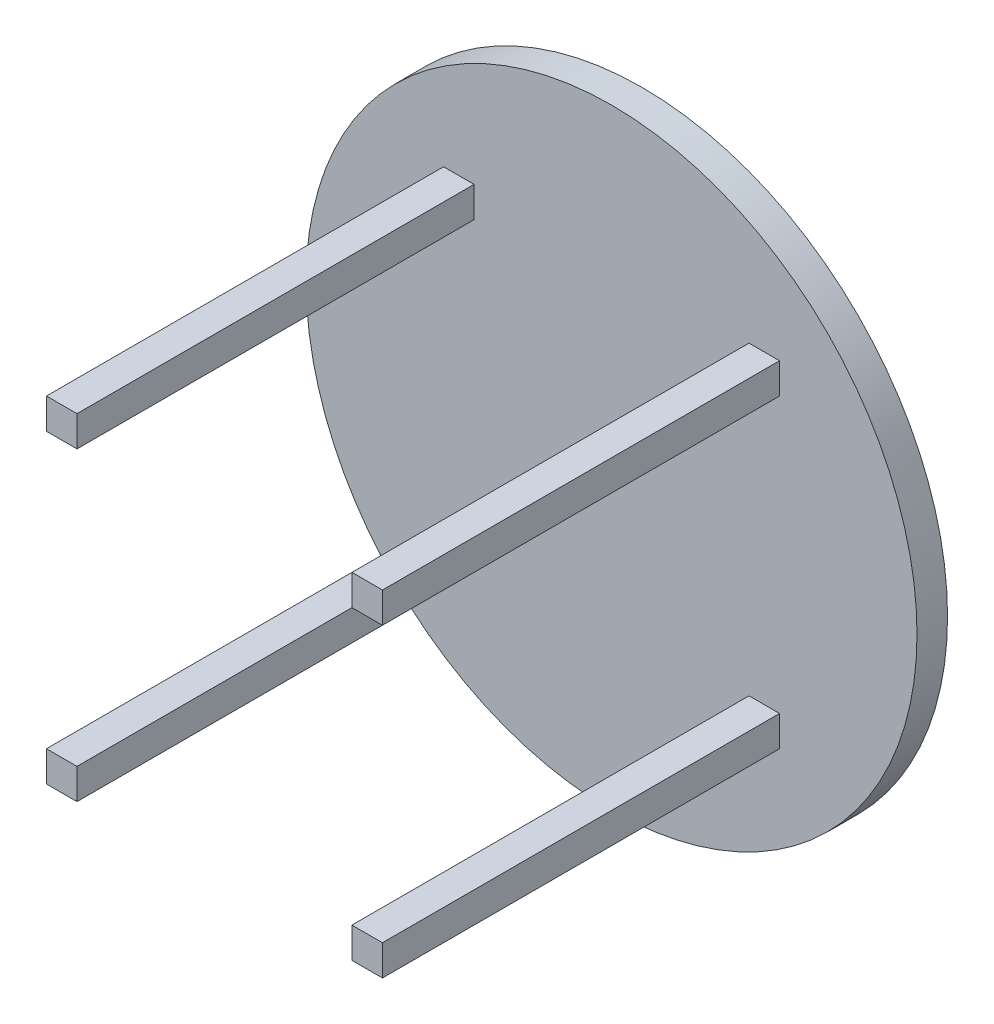
ISO-10303-21;
HEADER;
FILE_DESCRIPTION(('STEP AP214'),'2;1');
FILE_NAME('part.step','',(''),(''),'','','');
FILE_SCHEMA(('AUTOMOTIVE_DESIGN { 1 0 10303 214 1 1 1 1 }'));
ENDSEC;
DATA;
#1=APPLICATION_CONTEXT('core data for automotive mechanical design processes');
#2=APPLICATION_PROTOCOL_DEFINITION('international standard','automotive_design',2000,#1);
#3=PRODUCT_CONTEXT('',#1,'mechanical');
#4=PRODUCT('Part','Part','',(#3));
#5=PRODUCT_RELATED_PRODUCT_CATEGORY('part','',(#4));
#6=PRODUCT_DEFINITION_FORMATION('','',#4);
#7=PRODUCT_DEFINITION_CONTEXT('part definition',#1,'design');
#8=PRODUCT_DEFINITION('design','',#6,#7);
#9=PRODUCT_DEFINITION_SHAPE('','',#8);
#10=(LENGTH_UNIT() NAMED_UNIT(*) SI_UNIT(.MILLI.,.METRE.));
#11=(NAMED_UNIT(*) PLANE_ANGLE_UNIT() SI_UNIT($,.RADIAN.));
#12=(NAMED_UNIT(*) SI_UNIT($,.STERADIAN.) SOLID_ANGLE_UNIT());
#13=UNCERTAINTY_MEASURE_WITH_UNIT(LENGTH_MEASURE(1.E-05),#10,'distance_accuracy_value','');
#14=(GEOMETRIC_REPRESENTATION_CONTEXT(3) GLOBAL_UNCERTAINTY_ASSIGNED_CONTEXT((#13)) GLOBAL_UNIT_ASSIGNED_CONTEXT((#10,
#11,#12)) REPRESENTATION_CONTEXT('',''));
#15=CARTESIAN_POINT('',(0.,0.,0.));
#16=DIRECTION('',(0.,0.,1.));
#17=DIRECTION('',(1.,0.,0.));
#18=AXIS2_PLACEMENT_3D('',#15,#16,#17);
#19=CARTESIAN_POINT('',(0.,0.,0.));
#20=DIRECTION('',(0.,0.,1.));
#21=DIRECTION('',(1.,0.,0.));
#22=AXIS2_PLACEMENT_3D('',#19,#20,#21);
#23=PLANE('',#22);
#24=CARTESIAN_POINT('',(0.,0.,0.));
#25=DIRECTION('',(0.,0.,1.));
#26=DIRECTION('',(1.,0.,0.));
#27=AXIS2_PLACEMENT_3D('',#24,#25,#26);
#28=CIRCLE('',#27,500.);
#29=CARTESIAN_POINT('',(500.,0.,0.));
#30=VERTEX_POINT('',#29);
#31=EDGE_CURVE('E384',#30,#30,#28,.T.);
#32=ORIENTED_EDGE('',*,*,#31,.F.);
#33=EDGE_LOOP('',(#32));
#34=FACE_BOUND('',#33,.T.);
#35=DIRECTION('',(1.,0.,0.));
#36=VECTOR('',#35,1.);
#37=CARTESIAN_POINT('',(0.,245.,0.));
#38=LINE('',#37,#36);
#39=CARTESIAN_POINT('',(-75.,245.,0.));
#40=VERTEX_POINT('',#39);
#41=CARTESIAN_POINT('',(75.,245.,0.));
#42=VERTEX_POINT('',#41);
#43=EDGE_CURVE('E11',#40,#42,#38,.T.);
#44=ORIENTED_EDGE('',*,*,#43,.T.);
#45=DIRECTION('',(0.,1.,0.));
#46=VECTOR('',#45,1.);
#47=CARTESIAN_POINT('',(75.,0.,0.));
#48=LINE('',#47,#46);
#49=CARTESIAN_POINT('',(75.,275.,0.));
#50=VERTEX_POINT('',#49);
#51=EDGE_CURVE('E234',#42,#50,#48,.T.);
#52=ORIENTED_EDGE('',*,*,#51,.T.);
#53=DIRECTION('',(1.,0.,0.));
#54=VECTOR('',#53,1.);
#55=CARTESIAN_POINT('',(0.,275.,0.));
#56=LINE('',#55,#54);
#57=CARTESIAN_POINT('',(100.,275.,0.));
#58=VERTEX_POINT('',#57);
#59=EDGE_CURVE('E64',#50,#58,#56,.T.);
#60=ORIENTED_EDGE('',*,*,#59,.T.);
#61=DIRECTION('',(0.,-1.,0.));
#62=VECTOR('',#61,1.);
#63=CARTESIAN_POINT('',(100.,0.,0.));
#64=LINE('',#63,#62);
#65=CARTESIAN_POINT('',(100.,325.,0.));
#66=VERTEX_POINT('',#65);
#67=EDGE_CURVE('E395',#66,#58,#64,.T.);
#68=ORIENTED_EDGE('',*,*,#67,.F.);
#69=DIRECTION('',(1.,0.,0.));
#70=VECTOR('',#69,1.);
#71=CARTESIAN_POINT('',(0.,325.,0.));
#72=LINE('',#71,#70);
#73=CARTESIAN_POINT('',(-100.,325.,0.));
#74=VERTEX_POINT('',#73);
#75=EDGE_CURVE('E49',#74,#66,#72,.T.);
#76=ORIENTED_EDGE('',*,*,#75,.F.);
#77=DIRECTION('',(0.,1.,0.));
#78=VECTOR('',#77,1.);
#79=CARTESIAN_POINT('',(-100.,0.,0.));
#80=LINE('',#79,#78);
#81=CARTESIAN_POINT('',(-100.,275.,0.));
#82=VERTEX_POINT('',#81);
#83=EDGE_CURVE('E393',#82,#74,#80,.T.);
#84=ORIENTED_EDGE('',*,*,#83,.F.);
#85=CARTESIAN_POINT('',(-75.,275.,0.));
#86=VERTEX_POINT('',#85);
#87=EDGE_CURVE('E390',#82,#86,#56,.T.);
#88=ORIENTED_EDGE('',*,*,#87,.T.);
#89=DIRECTION('',(0.,-1.,0.));
#90=VECTOR('',#89,1.);
#91=CARTESIAN_POINT('',(-75.,0.,0.));
#92=LINE('',#91,#90);
#93=EDGE_CURVE('E231',#86,#40,#92,.T.);
#94=ORIENTED_EDGE('',*,*,#93,.T.);
#95=EDGE_LOOP('',(#44,#52,#60,#68,#76,#84,#88,#94));
#96=FACE_BOUND('',#95,.T.);
#97=ADVANCED_FACE('F41',(#34,#96),#23,.F.);
#98=CARTESIAN_POINT('',(0.,0.,50.));
#99=DIRECTION('',(0.,0.,1.));
#100=DIRECTION('',(1.,0.,0.));
#101=AXIS2_PLACEMENT_3D('',#98,#99,#100);
#102=PLANE('',#101);
#103=CARTESIAN_POINT('',(0.,0.,50.));
#104=DIRECTION('',(0.,0.,1.));
#105=DIRECTION('',(1.,0.,0.));
#106=AXIS2_PLACEMENT_3D('',#103,#104,#105);
#107=CIRCLE('',#106,500.);
#108=CARTESIAN_POINT('',(500.,0.,50.));
#109=VERTEX_POINT('',#108);
#110=EDGE_CURVE('E385',#109,#109,#107,.T.);
#111=ORIENTED_EDGE('',*,*,#110,.T.);
#112=EDGE_LOOP('',(#111));
#113=FACE_BOUND('',#112,.T.);
#114=DIRECTION('',(1.,0.,0.));
#115=VECTOR('',#114,1.);
#116=CARTESIAN_POINT('',(0.,275.,50.));
#117=LINE('',#116,#115);
#118=CARTESIAN_POINT('',(225.,275.,50.));
#119=VERTEX_POINT('',#118);
#120=CARTESIAN_POINT('',(275.,275.,50.));
#121=VERTEX_POINT('',#120);
#122=EDGE_CURVE('E378',#119,#121,#117,.T.);
#123=ORIENTED_EDGE('',*,*,#122,.T.);
#124=DIRECTION('',(0.,-1.,0.));
#125=VECTOR('',#124,1.);
#126=CARTESIAN_POINT('',(275.,0.,50.));
#127=LINE('',#126,#125);
#128=CARTESIAN_POINT('',(275.,225.,50.));
#129=VERTEX_POINT('',#128);
#130=EDGE_CURVE('E381',#121,#129,#127,.T.);
#131=ORIENTED_EDGE('',*,*,#130,.T.);
#132=DIRECTION('',(-1.,0.,0.));
#133=VECTOR('',#132,1.);
#134=CARTESIAN_POINT('',(0.,225.,50.));
#135=LINE('',#134,#133);
#136=CARTESIAN_POINT('',(225.,225.,50.));
#137=VERTEX_POINT('',#136);
#138=EDGE_CURVE('E372',#129,#137,#135,.T.);
#139=ORIENTED_EDGE('',*,*,#138,.T.);
#140=DIRECTION('',(0.,1.,0.));
#141=VECTOR('',#140,1.);
#142=CARTESIAN_POINT('',(225.,0.,50.));
#143=LINE('',#142,#141);
#144=EDGE_CURVE('E375',#137,#119,#143,.T.);
#145=ORIENTED_EDGE('',*,*,#144,.T.);
#146=EDGE_LOOP('',(#123,#131,#139,#145));
#147=FACE_BOUND('',#146,.T.);
#148=DIRECTION('',(1.,0.,0.));
#149=VECTOR('',#148,1.);
#150=CARTESIAN_POINT('',(0.,275.,50.));
#151=LINE('',#150,#149);
#152=CARTESIAN_POINT('',(-275.,275.,50.));
#153=VERTEX_POINT('',#152);
#154=CARTESIAN_POINT('',(-225.,275.,50.));
#155=VERTEX_POINT('',#154);
#156=EDGE_CURVE('E346',#153,#155,#151,.T.);
#157=ORIENTED_EDGE('',*,*,#156,.T.);
#158=DIRECTION('',(0.,-1.,0.));
#159=VECTOR('',#158,1.);
#160=CARTESIAN_POINT('',(-225.,0.,50.));
#161=LINE('',#160,#159);
#162=CARTESIAN_POINT('',(-225.,225.,50.));
#163=VERTEX_POINT('',#162);
#164=EDGE_CURVE('E349',#155,#163,#161,.T.);
#165=ORIENTED_EDGE('',*,*,#164,.T.);
#166=DIRECTION('',(-1.,0.,0.));
#167=VECTOR('',#166,1.);
#168=CARTESIAN_POINT('',(0.,225.,50.));
#169=LINE('',#168,#167);
#170=CARTESIAN_POINT('',(-275.,225.,50.));
#171=VERTEX_POINT('',#170);
#172=EDGE_CURVE('E340',#163,#171,#169,.T.);
#173=ORIENTED_EDGE('',*,*,#172,.T.);
#174=DIRECTION('',(0.,1.,0.));
#175=VECTOR('',#174,1.);
#176=CARTESIAN_POINT('',(-275.,0.,50.));
#177=LINE('',#176,#175);
#178=EDGE_CURVE('E343',#171,#153,#177,.T.);
#179=ORIENTED_EDGE('',*,*,#178,.T.);
#180=EDGE_LOOP('',(#157,#165,#173,#179));
#181=FACE_BOUND('',#180,.T.);
#182=DIRECTION('',(1.,0.,0.));
#183=VECTOR('',#182,1.);
#184=CARTESIAN_POINT('',(0.,-225.,50.));
#185=LINE('',#184,#183);
#186=CARTESIAN_POINT('',(225.,-225.,50.));
#187=VERTEX_POINT('',#186);
#188=CARTESIAN_POINT('',(275.,-225.,50.));
#189=VERTEX_POINT('',#188);
#190=EDGE_CURVE('E314',#187,#189,#185,.T.);
#191=ORIENTED_EDGE('',*,*,#190,.T.);
#192=DIRECTION('',(0.,-1.,0.));
#193=VECTOR('',#192,1.);
#194=CARTESIAN_POINT('',(275.,0.,50.));
#195=LINE('',#194,#193);
#196=CARTESIAN_POINT('',(275.,-275.,50.));
#197=VERTEX_POINT('',#196);
#198=EDGE_CURVE('E317',#189,#197,#195,.T.);
#199=ORIENTED_EDGE('',*,*,#198,.T.);
#200=DIRECTION('',(-1.,0.,0.));
#201=VECTOR('',#200,1.);
#202=CARTESIAN_POINT('',(0.,-275.,50.));
#203=LINE('',#202,#201);
#204=CARTESIAN_POINT('',(225.,-275.,50.));
#205=VERTEX_POINT('',#204);
#206=EDGE_CURVE('E308',#197,#205,#203,.T.);
#207=ORIENTED_EDGE('',*,*,#206,.T.);
#208=DIRECTION('',(0.,1.,0.));
#209=VECTOR('',#208,1.);
#210=CARTESIAN_POINT('',(225.,0.,50.));
#211=LINE('',#210,#209);
#212=EDGE_CURVE('E311',#205,#187,#211,.T.);
#213=ORIENTED_EDGE('',*,*,#212,.T.);
#214=EDGE_LOOP('',(#191,#199,#207,#213));
#215=FACE_BOUND('',#214,.T.);
#216=DIRECTION('',(1.,0.,0.));
#217=VECTOR('',#216,1.);
#218=CARTESIAN_POINT('',(0.,-225.,50.));
#219=LINE('',#218,#217);
#220=CARTESIAN_POINT('',(-275.,-225.,50.));
#221=VERTEX_POINT('',#220);
#222=CARTESIAN_POINT('',(-225.,-225.,50.));
#223=VERTEX_POINT('',#222);
#224=EDGE_CURVE('E282',#221,#223,#219,.T.);
#225=ORIENTED_EDGE('',*,*,#224,.T.);
#226=DIRECTION('',(0.,-1.,0.));
#227=VECTOR('',#226,1.);
#228=CARTESIAN_POINT('',(-225.,0.,50.));
#229=LINE('',#228,#227);
#230=CARTESIAN_POINT('',(-225.,-275.,50.));
#231=VERTEX_POINT('',#230);
#232=EDGE_CURVE('E285',#223,#231,#229,.T.);
#233=ORIENTED_EDGE('',*,*,#232,.T.);
#234=DIRECTION('',(-1.,0.,0.));
#235=VECTOR('',#234,1.);
#236=CARTESIAN_POINT('',(0.,-275.,50.));
#237=LINE('',#236,#235);
#238=CARTESIAN_POINT('',(-275.,-275.,50.));
#239=VERTEX_POINT('',#238);
#240=EDGE_CURVE('E276',#231,#239,#237,.T.);
#241=ORIENTED_EDGE('',*,*,#240,.T.);
#242=DIRECTION('',(0.,1.,0.));
#243=VECTOR('',#242,1.);
#244=CARTESIAN_POINT('',(-275.,0.,50.));
#245=LINE('',#244,#243);
#246=EDGE_CURVE('E279',#239,#221,#245,.T.);
#247=ORIENTED_EDGE('',*,*,#246,.T.);
#248=EDGE_LOOP('',(#225,#233,#241,#247));
#249=FACE_BOUND('',#248,.T.);
#250=ADVANCED_FACE('F408',(#113,#147,#181,#215,#249),#102,.T.);
#251=CARTESIAN_POINT('',(0.,0.,50.));
#252=DIRECTION('',(0.,0.,-1.));
#253=DIRECTION('',(-1.,0.,0.));
#254=AXIS2_PLACEMENT_3D('',#251,#252,#253);
#255=CYLINDRICAL_SURFACE('',#254,500.);
#256=ORIENTED_EDGE('',*,*,#110,.F.);
#257=EDGE_LOOP('',(#256));
#258=FACE_BOUND('',#257,.T.);
#259=ORIENTED_EDGE('',*,*,#31,.T.);
#260=EDGE_LOOP('',(#259));
#261=FACE_BOUND('',#260,.T.);
#262=ADVANCED_FACE('F43',(#258,#261),#255,.T.);
#263=CARTESIAN_POINT('',(275.,225.,700.));
#264=DIRECTION('',(-1.,0.,0.));
#265=DIRECTION('',(0.,0.,1.));
#266=AXIS2_PLACEMENT_3D('',#263,#264,#265);
#267=PLANE('',#266);
#268=ORIENTED_EDGE('',*,*,#130,.F.);
#269=DIRECTION('',(0.,0.,-1.));
#270=VECTOR('',#269,1.);
#271=CARTESIAN_POINT('',(275.,275.,700.));
#272=LINE('',#271,#270);
#273=CARTESIAN_POINT('',(275.,275.,700.));
#274=VERTEX_POINT('',#273);
#275=EDGE_CURVE('E369',#274,#121,#272,.T.);
#276=ORIENTED_EDGE('',*,*,#275,.F.);
#277=DIRECTION('',(0.,1.,0.));
#278=VECTOR('',#277,1.);
#279=CARTESIAN_POINT('',(275.,225.,700.));
#280=LINE('',#279,#278);
#281=CARTESIAN_POINT('',(275.,225.,700.));
#282=VERTEX_POINT('',#281);
#283=EDGE_CURVE('E352',#282,#274,#280,.T.);
#284=ORIENTED_EDGE('',*,*,#283,.F.);
#285=DIRECTION('',(0.,0.,-1.));
#286=VECTOR('',#285,1.);
#287=CARTESIAN_POINT('',(275.,225.,700.));
#288=LINE('',#287,#286);
#289=EDGE_CURVE('E361',#282,#129,#288,.T.);
#290=ORIENTED_EDGE('',*,*,#289,.T.);
#291=EDGE_LOOP('',(#268,#276,#284,#290));
#292=FACE_BOUND('',#291,.T.);
#293=ADVANCED_FACE('F419',(#292),#267,.F.);
#294=CARTESIAN_POINT('',(225.,275.,700.));
#295=DIRECTION('',(0.,-1.,0.));
#296=DIRECTION('',(0.,0.,-1.));
#297=AXIS2_PLACEMENT_3D('',#294,#295,#296);
#298=PLANE('',#297);
#299=ORIENTED_EDGE('',*,*,#122,.F.);
#300=DIRECTION('',(0.,0.,-1.));
#301=VECTOR('',#300,1.);
#302=CARTESIAN_POINT('',(225.,275.,700.));
#303=LINE('',#302,#301);
#304=CARTESIAN_POINT('',(225.,275.,700.));
#305=VERTEX_POINT('',#304);
#306=EDGE_CURVE('E366',#305,#119,#303,.T.);
#307=ORIENTED_EDGE('',*,*,#306,.F.);
#308=DIRECTION('',(-1.,0.,0.));
#309=VECTOR('',#308,1.);
#310=CARTESIAN_POINT('',(225.,275.,700.));
#311=LINE('',#310,#309);
#312=EDGE_CURVE('E355',#274,#305,#311,.T.);
#313=ORIENTED_EDGE('',*,*,#312,.F.);
#314=ORIENTED_EDGE('',*,*,#275,.T.);
#315=EDGE_LOOP('',(#299,#307,#313,#314));
#316=FACE_BOUND('',#315,.T.);
#317=ADVANCED_FACE('F422',(#316),#298,.F.);
#318=CARTESIAN_POINT('',(225.,225.,700.));
#319=DIRECTION('',(1.,0.,0.));
#320=DIRECTION('',(0.,0.,-1.));
#321=AXIS2_PLACEMENT_3D('',#318,#319,#320);
#322=PLANE('',#321);
#323=ORIENTED_EDGE('',*,*,#144,.F.);
#324=DIRECTION('',(0.,0.,-1.));
#325=VECTOR('',#324,1.);
#326=CARTESIAN_POINT('',(225.,225.,700.));
#327=LINE('',#326,#325);
#328=CARTESIAN_POINT('',(225.,225.,700.));
#329=VERTEX_POINT('',#328);
#330=EDGE_CURVE('E364',#329,#137,#327,.T.);
#331=ORIENTED_EDGE('',*,*,#330,.F.);
#332=DIRECTION('',(0.,-1.,0.));
#333=VECTOR('',#332,1.);
#334=CARTESIAN_POINT('',(225.,225.,700.));
#335=LINE('',#334,#333);
#336=EDGE_CURVE('E357',#305,#329,#335,.T.);
#337=ORIENTED_EDGE('',*,*,#336,.F.);
#338=ORIENTED_EDGE('',*,*,#306,.T.);
#339=EDGE_LOOP('',(#323,#331,#337,#338));
#340=FACE_BOUND('',#339,.T.);
#341=ADVANCED_FACE('F426',(#340),#322,.F.);
#342=CARTESIAN_POINT('',(225.,225.,700.));
#343=DIRECTION('',(0.,1.,0.));
#344=DIRECTION('',(0.,0.,1.));
#345=AXIS2_PLACEMENT_3D('',#342,#343,#344);
#346=PLANE('',#345);
#347=ORIENTED_EDGE('',*,*,#138,.F.);
#348=ORIENTED_EDGE('',*,*,#289,.F.);
#349=DIRECTION('',(1.,0.,0.));
#350=VECTOR('',#349,1.);
#351=CARTESIAN_POINT('',(225.,225.,700.));
#352=LINE('',#351,#350);
#353=EDGE_CURVE('E359',#329,#282,#352,.T.);
#354=ORIENTED_EDGE('',*,*,#353,.F.);
#355=ORIENTED_EDGE('',*,*,#330,.T.);
#356=EDGE_LOOP('',(#347,#348,#354,#355));
#357=FACE_BOUND('',#356,.T.);
#358=ADVANCED_FACE('F430',(#357),#346,.F.);
#359=CARTESIAN_POINT('',(0.,0.,700.));
#360=DIRECTION('',(0.,0.,-1.));
#361=DIRECTION('',(-1.,0.,0.));
#362=AXIS2_PLACEMENT_3D('',#359,#360,#361);
#363=PLANE('',#362);
#364=ORIENTED_EDGE('',*,*,#283,.T.);
#365=ORIENTED_EDGE('',*,*,#312,.T.);
#366=ORIENTED_EDGE('',*,*,#336,.T.);
#367=ORIENTED_EDGE('',*,*,#353,.T.);
#368=EDGE_LOOP('',(#364,#365,#366,#367));
#369=FACE_BOUND('',#368,.T.);
#370=ADVANCED_FACE('F434',(#369),#363,.F.);
#371=CARTESIAN_POINT('',(-225.,225.,700.));
#372=DIRECTION('',(-1.,0.,0.));
#373=DIRECTION('',(0.,0.,1.));
#374=AXIS2_PLACEMENT_3D('',#371,#372,#373);
#375=PLANE('',#374);
#376=ORIENTED_EDGE('',*,*,#164,.F.);
#377=DIRECTION('',(0.,0.,-1.));
#378=VECTOR('',#377,1.);
#379=CARTESIAN_POINT('',(-225.,275.,700.));
#380=LINE('',#379,#378);
#381=CARTESIAN_POINT('',(-225.,275.,700.));
#382=VERTEX_POINT('',#381);
#383=EDGE_CURVE('E337',#382,#155,#380,.T.);
#384=ORIENTED_EDGE('',*,*,#383,.F.);
#385=DIRECTION('',(0.,1.,0.));
#386=VECTOR('',#385,1.);
#387=CARTESIAN_POINT('',(-225.,225.,700.));
#388=LINE('',#387,#386);
#389=CARTESIAN_POINT('',(-225.,225.,700.));
#390=VERTEX_POINT('',#389);
#391=EDGE_CURVE('E320',#390,#382,#388,.T.);
#392=ORIENTED_EDGE('',*,*,#391,.F.);
#393=DIRECTION('',(0.,0.,-1.));
#394=VECTOR('',#393,1.);
#395=CARTESIAN_POINT('',(-225.,225.,700.));
#396=LINE('',#395,#394);
#397=EDGE_CURVE('E329',#390,#163,#396,.T.);
#398=ORIENTED_EDGE('',*,*,#397,.T.);
#399=EDGE_LOOP('',(#376,#384,#392,#398));
#400=FACE_BOUND('',#399,.T.);
#401=ADVANCED_FACE('F438',(#400),#375,.F.);
#402=CARTESIAN_POINT('',(-275.,275.,700.));
#403=DIRECTION('',(0.,-1.,0.));
#404=DIRECTION('',(0.,0.,-1.));
#405=AXIS2_PLACEMENT_3D('',#402,#403,#404);
#406=PLANE('',#405);
#407=ORIENTED_EDGE('',*,*,#156,.F.);
#408=DIRECTION('',(0.,0.,-1.));
#409=VECTOR('',#408,1.);
#410=CARTESIAN_POINT('',(-275.,275.,700.));
#411=LINE('',#410,#409);
#412=CARTESIAN_POINT('',(-275.,275.,700.));
#413=VERTEX_POINT('',#412);
#414=EDGE_CURVE('E334',#413,#153,#411,.T.);
#415=ORIENTED_EDGE('',*,*,#414,.F.);
#416=DIRECTION('',(-1.,0.,0.));
#417=VECTOR('',#416,1.);
#418=CARTESIAN_POINT('',(-275.,275.,700.));
#419=LINE('',#418,#417);
#420=EDGE_CURVE('E323',#382,#413,#419,.T.);
#421=ORIENTED_EDGE('',*,*,#420,.F.);
#422=ORIENTED_EDGE('',*,*,#383,.T.);
#423=EDGE_LOOP('',(#407,#415,#421,#422));
#424=FACE_BOUND('',#423,.T.);
#425=ADVANCED_FACE('F442',(#424),#406,.F.);
#426=CARTESIAN_POINT('',(-275.,225.,700.));
#427=DIRECTION('',(1.,0.,0.));
#428=DIRECTION('',(0.,0.,-1.));
#429=AXIS2_PLACEMENT_3D('',#426,#427,#428);
#430=PLANE('',#429);
#431=ORIENTED_EDGE('',*,*,#178,.F.);
#432=DIRECTION('',(0.,0.,-1.));
#433=VECTOR('',#432,1.);
#434=CARTESIAN_POINT('',(-275.,225.,700.));
#435=LINE('',#434,#433);
#436=CARTESIAN_POINT('',(-275.,225.,700.));
#437=VERTEX_POINT('',#436);
#438=EDGE_CURVE('E332',#437,#171,#435,.T.);
#439=ORIENTED_EDGE('',*,*,#438,.F.);
#440=DIRECTION('',(0.,-1.,0.));
#441=VECTOR('',#440,1.);
#442=CARTESIAN_POINT('',(-275.,225.,700.));
#443=LINE('',#442,#441);
#444=EDGE_CURVE('E325',#413,#437,#443,.T.);
#445=ORIENTED_EDGE('',*,*,#444,.F.);
#446=ORIENTED_EDGE('',*,*,#414,.T.);
#447=EDGE_LOOP('',(#431,#439,#445,#446));
#448=FACE_BOUND('',#447,.T.);
#449=ADVANCED_FACE('F446',(#448),#430,.F.);
#450=CARTESIAN_POINT('',(-275.,225.,700.));
#451=DIRECTION('',(0.,1.,0.));
#452=DIRECTION('',(0.,0.,1.));
#453=AXIS2_PLACEMENT_3D('',#450,#451,#452);
#454=PLANE('',#453);
#455=ORIENTED_EDGE('',*,*,#172,.F.);
#456=ORIENTED_EDGE('',*,*,#397,.F.);
#457=DIRECTION('',(1.,0.,0.));
#458=VECTOR('',#457,1.);
#459=CARTESIAN_POINT('',(-275.,225.,700.));
#460=LINE('',#459,#458);
#461=EDGE_CURVE('E327',#437,#390,#460,.T.);
#462=ORIENTED_EDGE('',*,*,#461,.F.);
#463=ORIENTED_EDGE('',*,*,#438,.T.);
#464=EDGE_LOOP('',(#455,#456,#462,#463));
#465=FACE_BOUND('',#464,.T.);
#466=ADVANCED_FACE('F450',(#465),#454,.F.);
#467=CARTESIAN_POINT('',(0.,0.,700.));
#468=DIRECTION('',(0.,0.,-1.));
#469=DIRECTION('',(-1.,0.,0.));
#470=AXIS2_PLACEMENT_3D('',#467,#468,#469);
#471=PLANE('',#470);
#472=ORIENTED_EDGE('',*,*,#391,.T.);
#473=ORIENTED_EDGE('',*,*,#420,.T.);
#474=ORIENTED_EDGE('',*,*,#444,.T.);
#475=ORIENTED_EDGE('',*,*,#461,.T.);
#476=EDGE_LOOP('',(#472,#473,#474,#475));
#477=FACE_BOUND('',#476,.T.);
#478=ADVANCED_FACE('F454',(#477),#471,.F.);
#479=CARTESIAN_POINT('',(275.,-275.,700.));
#480=DIRECTION('',(-1.,0.,0.));
#481=DIRECTION('',(0.,0.,1.));
#482=AXIS2_PLACEMENT_3D('',#479,#480,#481);
#483=PLANE('',#482);
#484=ORIENTED_EDGE('',*,*,#198,.F.);
#485=DIRECTION('',(0.,0.,-1.));
#486=VECTOR('',#485,1.);
#487=CARTESIAN_POINT('',(275.,-225.,700.));
#488=LINE('',#487,#486);
#489=CARTESIAN_POINT('',(275.,-225.,700.));
#490=VERTEX_POINT('',#489);
#491=EDGE_CURVE('E305',#490,#189,#488,.T.);
#492=ORIENTED_EDGE('',*,*,#491,.F.);
#493=DIRECTION('',(0.,1.,0.));
#494=VECTOR('',#493,1.);
#495=CARTESIAN_POINT('',(275.,-275.,700.));
#496=LINE('',#495,#494);
#497=CARTESIAN_POINT('',(275.,-275.,700.));
#498=VERTEX_POINT('',#497);
#499=EDGE_CURVE('E288',#498,#490,#496,.T.);
#500=ORIENTED_EDGE('',*,*,#499,.F.);
#501=DIRECTION('',(0.,0.,-1.));
#502=VECTOR('',#501,1.);
#503=CARTESIAN_POINT('',(275.,-275.,700.));
#504=LINE('',#503,#502);
#505=EDGE_CURVE('E297',#498,#197,#504,.T.);
#506=ORIENTED_EDGE('',*,*,#505,.T.);
#507=EDGE_LOOP('',(#484,#492,#500,#506));
#508=FACE_BOUND('',#507,.T.);
#509=ADVANCED_FACE('F458',(#508),#483,.F.);
#510=CARTESIAN_POINT('',(225.,-225.,700.));
#511=DIRECTION('',(0.,-1.,0.));
#512=DIRECTION('',(0.,0.,-1.));
#513=AXIS2_PLACEMENT_3D('',#510,#511,#512);
#514=PLANE('',#513);
#515=ORIENTED_EDGE('',*,*,#190,.F.);
#516=DIRECTION('',(0.,0.,-1.));
#517=VECTOR('',#516,1.);
#518=CARTESIAN_POINT('',(225.,-225.,700.));
#519=LINE('',#518,#517);
#520=CARTESIAN_POINT('',(225.,-225.,700.));
#521=VERTEX_POINT('',#520);
#522=EDGE_CURVE('E302',#521,#187,#519,.T.);
#523=ORIENTED_EDGE('',*,*,#522,.F.);
#524=DIRECTION('',(-1.,0.,0.));
#525=VECTOR('',#524,1.);
#526=CARTESIAN_POINT('',(225.,-225.,700.));
#527=LINE('',#526,#525);
#528=EDGE_CURVE('E291',#490,#521,#527,.T.);
#529=ORIENTED_EDGE('',*,*,#528,.F.);
#530=ORIENTED_EDGE('',*,*,#491,.T.);
#531=EDGE_LOOP('',(#515,#523,#529,#530));
#532=FACE_BOUND('',#531,.T.);
#533=ADVANCED_FACE('F462',(#532),#514,.F.);
#534=CARTESIAN_POINT('',(225.,-275.,700.));
#535=DIRECTION('',(1.,0.,0.));
#536=DIRECTION('',(0.,0.,-1.));
#537=AXIS2_PLACEMENT_3D('',#534,#535,#536);
#538=PLANE('',#537);
#539=ORIENTED_EDGE('',*,*,#212,.F.);
#540=DIRECTION('',(0.,0.,-1.));
#541=VECTOR('',#540,1.);
#542=CARTESIAN_POINT('',(225.,-275.,700.));
#543=LINE('',#542,#541);
#544=CARTESIAN_POINT('',(225.,-275.,700.));
#545=VERTEX_POINT('',#544);
#546=EDGE_CURVE('E300',#545,#205,#543,.T.);
#547=ORIENTED_EDGE('',*,*,#546,.F.);
#548=DIRECTION('',(0.,-1.,0.));
#549=VECTOR('',#548,1.);
#550=CARTESIAN_POINT('',(225.,-275.,700.));
#551=LINE('',#550,#549);
#552=EDGE_CURVE('E293',#521,#545,#551,.T.);
#553=ORIENTED_EDGE('',*,*,#552,.F.);
#554=ORIENTED_EDGE('',*,*,#522,.T.);
#555=EDGE_LOOP('',(#539,#547,#553,#554));
#556=FACE_BOUND('',#555,.T.);
#557=ADVANCED_FACE('F466',(#556),#538,.F.);
#558=CARTESIAN_POINT('',(225.,-275.,700.));
#559=DIRECTION('',(0.,1.,0.));
#560=DIRECTION('',(0.,0.,1.));
#561=AXIS2_PLACEMENT_3D('',#558,#559,#560);
#562=PLANE('',#561);
#563=ORIENTED_EDGE('',*,*,#206,.F.);
#564=ORIENTED_EDGE('',*,*,#505,.F.);
#565=DIRECTION('',(1.,0.,0.));
#566=VECTOR('',#565,1.);
#567=CARTESIAN_POINT('',(225.,-275.,700.));
#568=LINE('',#567,#566);
#569=EDGE_CURVE('E295',#545,#498,#568,.T.);
#570=ORIENTED_EDGE('',*,*,#569,.F.);
#571=ORIENTED_EDGE('',*,*,#546,.T.);
#572=EDGE_LOOP('',(#563,#564,#570,#571));
#573=FACE_BOUND('',#572,.T.);
#574=ADVANCED_FACE('F470',(#573),#562,.F.);
#575=CARTESIAN_POINT('',(0.,0.,700.));
#576=DIRECTION('',(0.,0.,-1.));
#577=DIRECTION('',(-1.,0.,0.));
#578=AXIS2_PLACEMENT_3D('',#575,#576,#577);
#579=PLANE('',#578);
#580=ORIENTED_EDGE('',*,*,#499,.T.);
#581=ORIENTED_EDGE('',*,*,#528,.T.);
#582=ORIENTED_EDGE('',*,*,#552,.T.);
#583=ORIENTED_EDGE('',*,*,#569,.T.);
#584=EDGE_LOOP('',(#580,#581,#582,#583));
#585=FACE_BOUND('',#584,.T.);
#586=ADVANCED_FACE('F474',(#585),#579,.F.);
#587=CARTESIAN_POINT('',(-225.,-275.,700.));
#588=DIRECTION('',(-1.,0.,0.));
#589=DIRECTION('',(0.,0.,1.));
#590=AXIS2_PLACEMENT_3D('',#587,#588,#589);
#591=PLANE('',#590);
#592=ORIENTED_EDGE('',*,*,#232,.F.);
#593=DIRECTION('',(0.,0.,-1.));
#594=VECTOR('',#593,1.);
#595=CARTESIAN_POINT('',(-225.,-225.,700.));
#596=LINE('',#595,#594);
#597=CARTESIAN_POINT('',(-225.,-225.,700.));
#598=VERTEX_POINT('',#597);
#599=EDGE_CURVE('E273',#598,#223,#596,.T.);
#600=ORIENTED_EDGE('',*,*,#599,.F.);
#601=DIRECTION('',(0.,1.,0.));
#602=VECTOR('',#601,1.);
#603=CARTESIAN_POINT('',(-225.,-275.,700.));
#604=LINE('',#603,#602);
#605=CARTESIAN_POINT('',(-225.,-275.,700.));
#606=VERTEX_POINT('',#605);
#607=EDGE_CURVE('E256',#606,#598,#604,.T.);
#608=ORIENTED_EDGE('',*,*,#607,.F.);
#609=DIRECTION('',(0.,0.,-1.));
#610=VECTOR('',#609,1.);
#611=CARTESIAN_POINT('',(-225.,-275.,700.));
#612=LINE('',#611,#610);
#613=EDGE_CURVE('E265',#606,#231,#612,.T.);
#614=ORIENTED_EDGE('',*,*,#613,.T.);
#615=EDGE_LOOP('',(#592,#600,#608,#614));
#616=FACE_BOUND('',#615,.T.);
#617=ADVANCED_FACE('F478',(#616),#591,.F.);
#618=CARTESIAN_POINT('',(-275.,-225.,700.));
#619=DIRECTION('',(0.,-1.,0.));
#620=DIRECTION('',(0.,0.,-1.));
#621=AXIS2_PLACEMENT_3D('',#618,#619,#620);
#622=PLANE('',#621);
#623=ORIENTED_EDGE('',*,*,#224,.F.);
#624=DIRECTION('',(0.,0.,-1.));
#625=VECTOR('',#624,1.);
#626=CARTESIAN_POINT('',(-275.,-225.,700.));
#627=LINE('',#626,#625);
#628=CARTESIAN_POINT('',(-275.,-225.,700.));
#629=VERTEX_POINT('',#628);
#630=EDGE_CURVE('E270',#629,#221,#627,.T.);
#631=ORIENTED_EDGE('',*,*,#630,.F.);
#632=DIRECTION('',(-1.,0.,0.));
#633=VECTOR('',#632,1.);
#634=CARTESIAN_POINT('',(-275.,-225.,700.));
#635=LINE('',#634,#633);
#636=EDGE_CURVE('E259',#598,#629,#635,.T.);
#637=ORIENTED_EDGE('',*,*,#636,.F.);
#638=ORIENTED_EDGE('',*,*,#599,.T.);
#639=EDGE_LOOP('',(#623,#631,#637,#638));
#640=FACE_BOUND('',#639,.T.);
#641=ADVANCED_FACE('F482',(#640),#622,.F.);
#642=CARTESIAN_POINT('',(-275.,-275.,700.));
#643=DIRECTION('',(1.,0.,0.));
#644=DIRECTION('',(0.,0.,-1.));
#645=AXIS2_PLACEMENT_3D('',#642,#643,#644);
#646=PLANE('',#645);
#647=ORIENTED_EDGE('',*,*,#246,.F.);
#648=DIRECTION('',(0.,0.,-1.));
#649=VECTOR('',#648,1.);
#650=CARTESIAN_POINT('',(-275.,-275.,700.));
#651=LINE('',#650,#649);
#652=CARTESIAN_POINT('',(-275.,-275.,700.));
#653=VERTEX_POINT('',#652);
#654=EDGE_CURVE('E268',#653,#239,#651,.T.);
#655=ORIENTED_EDGE('',*,*,#654,.F.);
#656=DIRECTION('',(0.,-1.,0.));
#657=VECTOR('',#656,1.);
#658=CARTESIAN_POINT('',(-275.,-275.,700.));
#659=LINE('',#658,#657);
#660=EDGE_CURVE('E261',#629,#653,#659,.T.);
#661=ORIENTED_EDGE('',*,*,#660,.F.);
#662=ORIENTED_EDGE('',*,*,#630,.T.);
#663=EDGE_LOOP('',(#647,#655,#661,#662));
#664=FACE_BOUND('',#663,.T.);
#665=ADVANCED_FACE('F486',(#664),#646,.F.);
#666=CARTESIAN_POINT('',(-275.,-275.,700.));
#667=DIRECTION('',(0.,1.,0.));
#668=DIRECTION('',(0.,0.,1.));
#669=AXIS2_PLACEMENT_3D('',#666,#667,#668);
#670=PLANE('',#669);
#671=ORIENTED_EDGE('',*,*,#240,.F.);
#672=ORIENTED_EDGE('',*,*,#613,.F.);
#673=DIRECTION('',(1.,0.,0.));
#674=VECTOR('',#673,1.);
#675=CARTESIAN_POINT('',(-275.,-275.,700.));
#676=LINE('',#675,#674);
#677=EDGE_CURVE('E263',#653,#606,#676,.T.);
#678=ORIENTED_EDGE('',*,*,#677,.F.);
#679=ORIENTED_EDGE('',*,*,#654,.T.);
#680=EDGE_LOOP('',(#671,#672,#678,#679));
#681=FACE_BOUND('',#680,.T.);
#682=ADVANCED_FACE('F490',(#681),#670,.F.);
#683=CARTESIAN_POINT('',(0.,0.,700.));
#684=DIRECTION('',(0.,0.,-1.));
#685=DIRECTION('',(-1.,0.,0.));
#686=AXIS2_PLACEMENT_3D('',#683,#684,#685);
#687=PLANE('',#686);
#688=ORIENTED_EDGE('',*,*,#607,.T.);
#689=ORIENTED_EDGE('',*,*,#636,.T.);
#690=ORIENTED_EDGE('',*,*,#660,.T.);
#691=ORIENTED_EDGE('',*,*,#677,.T.);
#692=EDGE_LOOP('',(#688,#689,#690,#691));
#693=FACE_BOUND('',#692,.T.);
#694=ADVANCED_FACE('F494',(#693),#687,.F.);
#695=CARTESIAN_POINT('',(100.,325.,50.));
#696=DIRECTION('',(-1.,0.,0.));
#697=DIRECTION('',(0.,0.,1.));
#698=AXIS2_PLACEMENT_3D('',#695,#696,#697);
#699=PLANE('',#698);
#700=DIRECTION('',(0.,0.,-1.));
#701=VECTOR('',#700,1.);
#702=CARTESIAN_POINT('',(100.,325.,50.));
#703=LINE('',#702,#701);
#704=CARTESIAN_POINT('',(100.,325.,-50.));
#705=VERTEX_POINT('',#704);
#706=EDGE_CURVE('E237',#66,#705,#703,.T.);
#707=ORIENTED_EDGE('',*,*,#706,.F.);
#708=ORIENTED_EDGE('',*,*,#67,.T.);
#709=DIRECTION('',(0.,0.,-1.));
#710=VECTOR('',#709,1.);
#711=CARTESIAN_POINT('',(100.,275.,50.));
#712=LINE('',#711,#710);
#713=CARTESIAN_POINT('',(100.,275.,-50.));
#714=VERTEX_POINT('',#713);
#715=EDGE_CURVE('E236',#58,#714,#712,.T.);
#716=ORIENTED_EDGE('',*,*,#715,.T.);
#717=DIRECTION('',(0.,-1.,0.));
#718=VECTOR('',#717,1.);
#719=CARTESIAN_POINT('',(100.,325.,-50.));
#720=LINE('',#719,#718);
#721=EDGE_CURVE('E253',#705,#714,#720,.T.);
#722=ORIENTED_EDGE('',*,*,#721,.F.);
#723=EDGE_LOOP('',(#707,#708,#716,#722));
#724=FACE_BOUND('',#723,.T.);
#725=ADVANCED_FACE('F406',(#724),#699,.F.);
#726=CARTESIAN_POINT('',(-100.,325.,50.));
#727=DIRECTION('',(1.,0.,0.));
#728=DIRECTION('',(0.,0.,-1.));
#729=AXIS2_PLACEMENT_3D('',#726,#727,#728);
#730=PLANE('',#729);
#731=DIRECTION('',(0.,0.,1.));
#732=VECTOR('',#731,1.);
#733=CARTESIAN_POINT('',(-100.,275.,50.));
#734=LINE('',#733,#732);
#735=CARTESIAN_POINT('',(-100.,275.,-50.));
#736=VERTEX_POINT('',#735);
#737=EDGE_CURVE('E240',#736,#82,#734,.T.);
#738=ORIENTED_EDGE('',*,*,#737,.T.);
#739=ORIENTED_EDGE('',*,*,#83,.T.);
#740=DIRECTION('',(0.,0.,1.));
#741=VECTOR('',#740,1.);
#742=CARTESIAN_POINT('',(-100.,325.,50.));
#743=LINE('',#742,#741);
#744=CARTESIAN_POINT('',(-100.,325.,-50.));
#745=VERTEX_POINT('',#744);
#746=EDGE_CURVE('E242',#745,#74,#743,.T.);
#747=ORIENTED_EDGE('',*,*,#746,.F.);
#748=DIRECTION('',(0.,-1.,0.));
#749=VECTOR('',#748,1.);
#750=CARTESIAN_POINT('',(-100.,325.,-50.));
#751=LINE('',#750,#749);
#752=EDGE_CURVE('E245',#745,#736,#751,.T.);
#753=ORIENTED_EDGE('',*,*,#752,.T.);
#754=EDGE_LOOP('',(#738,#739,#747,#753));
#755=FACE_BOUND('',#754,.T.);
#756=ADVANCED_FACE('F501',(#755),#730,.F.);
#757=CARTESIAN_POINT('',(0.,325.,0.));
#758=DIRECTION('',(0.,-1.,0.));
#759=DIRECTION('',(0.,0.,-1.));
#760=AXIS2_PLACEMENT_3D('',#757,#758,#759);
#761=PLANE('',#760);
#762=ORIENTED_EDGE('',*,*,#746,.T.);
#763=ORIENTED_EDGE('',*,*,#75,.T.);
#764=ORIENTED_EDGE('',*,*,#706,.T.);
#765=DIRECTION('',(-1.,0.,0.));
#766=VECTOR('',#765,1.);
#767=CARTESIAN_POINT('',(-100.,325.,-50.));
#768=LINE('',#767,#766);
#769=EDGE_CURVE('E239',#705,#745,#768,.T.);
#770=ORIENTED_EDGE('',*,*,#769,.T.);
#771=EDGE_LOOP('',(#762,#763,#764,#770));
#772=FACE_BOUND('',#771,.T.);
#773=ADVANCED_FACE('F400',(#772),#761,.F.);
#774=CARTESIAN_POINT('',(0.,275.,0.));
#775=DIRECTION('',(0.,-1.,0.));
#776=DIRECTION('',(0.,0.,-1.));
#777=AXIS2_PLACEMENT_3D('',#774,#775,#776);
#778=PLANE('',#777);
#779=ORIENTED_EDGE('',*,*,#59,.F.);
#780=DIRECTION('',(0.,0.,-1.));
#781=VECTOR('',#780,1.);
#782=CARTESIAN_POINT('',(75.,275.,25.));
#783=LINE('',#782,#781);
#784=CARTESIAN_POINT('',(75.,275.,25.));
#785=VERTEX_POINT('',#784);
#786=EDGE_CURVE('E226',#785,#50,#783,.T.);
#787=ORIENTED_EDGE('',*,*,#786,.F.);
#788=DIRECTION('',(1.,0.,0.));
#789=VECTOR('',#788,1.);
#790=CARTESIAN_POINT('',(-75.,275.,25.));
#791=LINE('',#790,#789);
#792=CARTESIAN_POINT('',(-75.,275.,25.));
#793=VERTEX_POINT('',#792);
#794=EDGE_CURVE('E229',#793,#785,#791,.T.);
#795=ORIENTED_EDGE('',*,*,#794,.F.);
#796=DIRECTION('',(0.,0.,1.));
#797=VECTOR('',#796,1.);
#798=CARTESIAN_POINT('',(-75.,275.,25.));
#799=LINE('',#798,#797);
#800=EDGE_CURVE('E56',#86,#793,#799,.T.);
#801=ORIENTED_EDGE('',*,*,#800,.F.);
#802=ORIENTED_EDGE('',*,*,#87,.F.);
#803=ORIENTED_EDGE('',*,*,#737,.F.);
#804=DIRECTION('',(-1.,0.,0.));
#805=VECTOR('',#804,1.);
#806=CARTESIAN_POINT('',(-100.,275.,-50.));
#807=LINE('',#806,#805);
#808=EDGE_CURVE('E247',#714,#736,#807,.T.);
#809=ORIENTED_EDGE('',*,*,#808,.F.);
#810=ORIENTED_EDGE('',*,*,#715,.F.);
#811=EDGE_LOOP('',(#779,#787,#795,#801,#802,#803,#809,#810));
#812=FACE_BOUND('',#811,.T.);
#813=ADVANCED_FACE('F504',(#812),#778,.T.);
#814=CARTESIAN_POINT('',(-100.,325.,-50.));
#815=DIRECTION('',(0.,0.,1.));
#816=DIRECTION('',(1.,0.,0.));
#817=AXIS2_PLACEMENT_3D('',#814,#815,#816);
#818=PLANE('',#817);
#819=ORIENTED_EDGE('',*,*,#808,.T.);
#820=ORIENTED_EDGE('',*,*,#752,.F.);
#821=ORIENTED_EDGE('',*,*,#769,.F.);
#822=ORIENTED_EDGE('',*,*,#721,.T.);
#823=EDGE_LOOP('',(#819,#820,#821,#822));
#824=FACE_BOUND('',#823,.T.);
#825=ADVANCED_FACE('F502',(#824),#818,.F.);
#826=CARTESIAN_POINT('',(0.,245.,0.));
#827=DIRECTION('',(0.,-1.,0.));
#828=DIRECTION('',(0.,0.,-1.));
#829=AXIS2_PLACEMENT_3D('',#826,#827,#828);
#830=PLANE('',#829);
#831=DIRECTION('',(0.,0.,1.));
#832=VECTOR('',#831,1.);
#833=CARTESIAN_POINT('',(-75.,245.,25.));
#834=LINE('',#833,#832);
#835=CARTESIAN_POINT('',(-75.,245.,25.));
#836=VERTEX_POINT('',#835);
#837=EDGE_CURVE('E204',#40,#836,#834,.T.);
#838=ORIENTED_EDGE('',*,*,#837,.T.);
#839=DIRECTION('',(1.,0.,0.));
#840=VECTOR('',#839,1.);
#841=CARTESIAN_POINT('',(-75.,245.,25.));
#842=LINE('',#841,#840);
#843=CARTESIAN_POINT('',(75.,245.,25.));
#844=VERTEX_POINT('',#843);
#845=EDGE_CURVE('E209',#836,#844,#842,.T.);
#846=ORIENTED_EDGE('',*,*,#845,.T.);
#847=DIRECTION('',(0.,0.,-1.));
#848=VECTOR('',#847,1.);
#849=CARTESIAN_POINT('',(75.,245.,25.));
#850=LINE('',#849,#848);
#851=EDGE_CURVE('E212',#844,#42,#850,.T.);
#852=ORIENTED_EDGE('',*,*,#851,.T.);
#853=ORIENTED_EDGE('',*,*,#43,.F.);
#854=EDGE_LOOP('',(#838,#846,#852,#853));
#855=FACE_BOUND('',#854,.T.);
#856=ADVANCED_FACE('F206',(#855),#830,.F.);
#857=CARTESIAN_POINT('',(75.,245.,25.));
#858=DIRECTION('',(1.,0.,0.));
#859=DIRECTION('',(0.,0.,-1.));
#860=AXIS2_PLACEMENT_3D('',#857,#858,#859);
#861=PLANE('',#860);
#862=ORIENTED_EDGE('',*,*,#851,.F.);
#863=DIRECTION('',(0.,1.,0.));
#864=VECTOR('',#863,1.);
#865=CARTESIAN_POINT('',(75.,245.,25.));
#866=LINE('',#865,#864);
#867=EDGE_CURVE('E219',#844,#785,#866,.T.);
#868=ORIENTED_EDGE('',*,*,#867,.T.);
#869=ORIENTED_EDGE('',*,*,#786,.T.);
#870=ORIENTED_EDGE('',*,*,#51,.F.);
#871=EDGE_LOOP('',(#862,#868,#869,#870));
#872=FACE_BOUND('',#871,.T.);
#873=ADVANCED_FACE('F512',(#872),#861,.F.);
#874=CARTESIAN_POINT('',(-75.,245.,25.));
#875=DIRECTION('',(-1.,0.,0.));
#876=DIRECTION('',(0.,0.,1.));
#877=AXIS2_PLACEMENT_3D('',#874,#875,#876);
#878=PLANE('',#877);
#879=ORIENTED_EDGE('',*,*,#800,.T.);
#880=DIRECTION('',(0.,1.,0.));
#881=VECTOR('',#880,1.);
#882=CARTESIAN_POINT('',(-75.,245.,25.));
#883=LINE('',#882,#881);
#884=EDGE_CURVE('E215',#836,#793,#883,.T.);
#885=ORIENTED_EDGE('',*,*,#884,.F.);
#886=ORIENTED_EDGE('',*,*,#837,.F.);
#887=ORIENTED_EDGE('',*,*,#93,.F.);
#888=EDGE_LOOP('',(#879,#885,#886,#887));
#889=FACE_BOUND('',#888,.T.);
#890=ADVANCED_FACE('F216',(#889),#878,.F.);
#891=CARTESIAN_POINT('',(-75.,245.,25.));
#892=DIRECTION('',(0.,0.,1.));
#893=DIRECTION('',(1.,0.,0.));
#894=AXIS2_PLACEMENT_3D('',#891,#892,#893);
#895=PLANE('',#894);
#896=ORIENTED_EDGE('',*,*,#794,.T.);
#897=ORIENTED_EDGE('',*,*,#867,.F.);
#898=ORIENTED_EDGE('',*,*,#845,.F.);
#899=ORIENTED_EDGE('',*,*,#884,.T.);
#900=EDGE_LOOP('',(#896,#897,#898,#899));
#901=FACE_BOUND('',#900,.T.);
#902=ADVANCED_FACE('F221',(#901),#895,.F.);
#903=CLOSED_SHELL('',(#97,#250,#262,#293,#317,#341,#358,#370,#401,#425,#449,#466,#478,#509,#533,
#557,#574,#586,#617,#641,#665,#682,#694,#725,#756,#773,#813,#825,#856,#873,#890,#902));
#904=MANIFOLD_SOLID_BREP('B2',#903);
#905=ADVANCED_BREP_SHAPE_REPRESENTATION('',(#18,#904),#14);
#906=SHAPE_DEFINITION_REPRESENTATION(#9,#905);
ENDSEC;
END-ISO-10303-21;
